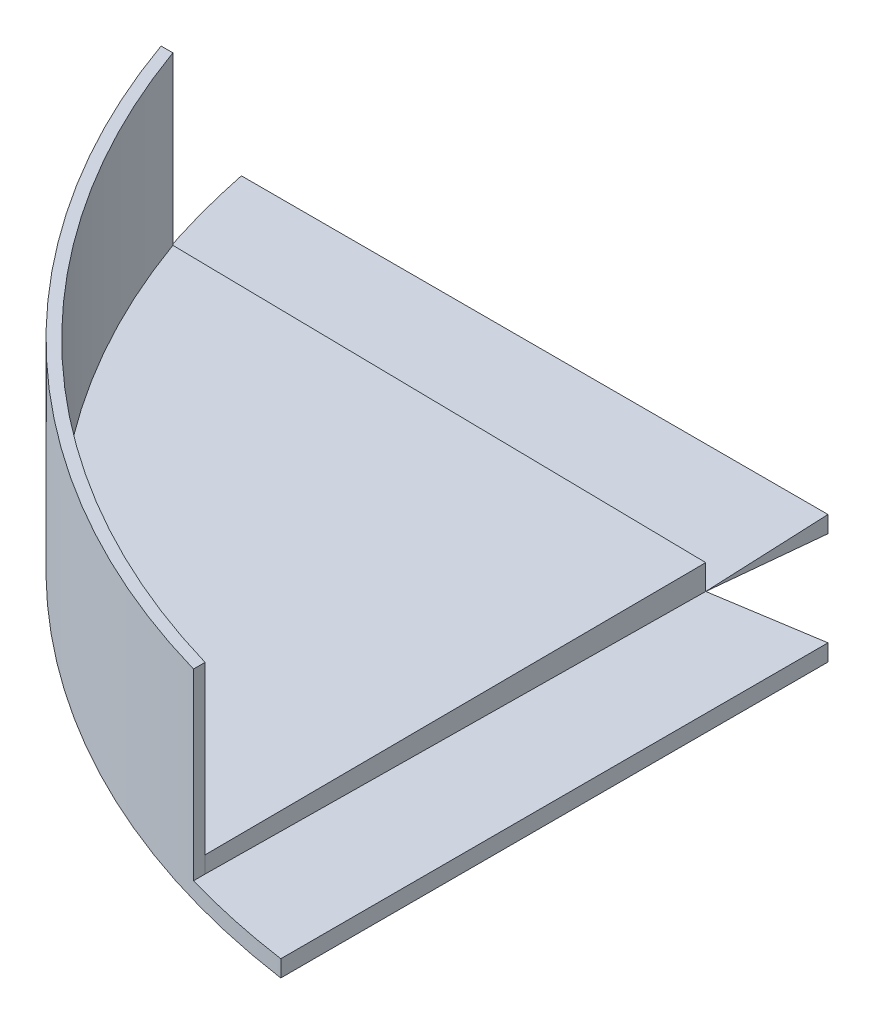
ISO-10303-21;
HEADER;
FILE_DESCRIPTION(('STEP AP214'),'2;1');
FILE_NAME('part.step','',(''),(''),'','','');
FILE_SCHEMA(('AUTOMOTIVE_DESIGN { 1 0 10303 214 1 1 1 1 }'));
ENDSEC;
DATA;
#1=APPLICATION_CONTEXT('core data for automotive mechanical design processes');
#2=APPLICATION_PROTOCOL_DEFINITION('international standard','automotive_design',2000,#1);
#3=PRODUCT_CONTEXT('',#1,'mechanical');
#4=PRODUCT('Part','Part','',(#3));
#5=PRODUCT_RELATED_PRODUCT_CATEGORY('part','',(#4));
#6=PRODUCT_DEFINITION_FORMATION('','',#4);
#7=PRODUCT_DEFINITION_CONTEXT('part definition',#1,'design');
#8=PRODUCT_DEFINITION('design','',#6,#7);
#9=PRODUCT_DEFINITION_SHAPE('','',#8);
#10=(LENGTH_UNIT() NAMED_UNIT(*) SI_UNIT(.MILLI.,.METRE.));
#11=(NAMED_UNIT(*) PLANE_ANGLE_UNIT() SI_UNIT($,.RADIAN.));
#12=(NAMED_UNIT(*) SI_UNIT($,.STERADIAN.) SOLID_ANGLE_UNIT());
#13=UNCERTAINTY_MEASURE_WITH_UNIT(LENGTH_MEASURE(1.E-05),#10,'distance_accuracy_value','');
#14=(GEOMETRIC_REPRESENTATION_CONTEXT(3) GLOBAL_UNCERTAINTY_ASSIGNED_CONTEXT((#13)) GLOBAL_UNIT_ASSIGNED_CONTEXT((#10,
#11,#12)) REPRESENTATION_CONTEXT('',''));
#15=CARTESIAN_POINT('',(0.,0.,0.));
#16=DIRECTION('',(0.,0.,1.));
#17=DIRECTION('',(1.,0.,0.));
#18=AXIS2_PLACEMENT_3D('',#15,#16,#17);
#19=CARTESIAN_POINT('',(-221.206600154719,2.,90.));
#20=DIRECTION('',(0.,1.,0.));
#21=DIRECTION('',(0.,0.,1.));
#22=AXIS2_PLACEMENT_3D('',#19,#20,#21);
#23=PLANE('',#22);
#24=DIRECTION('',(-0.0055195669768111,0.,-0.999984767074173));
#25=VECTOR('',#24,1.);
#26=CARTESIAN_POINT('',(-41.7143181817929,2.,89.0092652360406));
#27=LINE('',#26,#25);
#28=CARTESIAN_POINT('',(-41.4213562373095,2.,142.085436436891));
#29=VERTEX_POINT('',#28);
#30=CARTESIAN_POINT('',(-41.9213562373095,1.5,51.5));
#31=VERTEX_POINT('',#30);
#32=EDGE_CURVE('E151',#29,#31,#27,.T.);
#33=ORIENTED_EDGE('',*,*,#32,.F.);
#34=DIRECTION('',(0.,0.,-1.));
#35=VECTOR('',#34,1.);
#36=CARTESIAN_POINT('',(-41.4213562373095,2.,50.));
#37=LINE('',#36,#35);
#38=EDGE_CURVE('E149',#29,#31,#37,.T.);
#39=ORIENTED_EDGE('',*,*,#38,.T.);
#40=EDGE_LOOP('',(#33,#39));
#41=FACE_BOUND('',#40,.T.);
#42=ADVANCED_FACE('F34',(#41),#23,.T.);
#43=CARTESIAN_POINT('',(-221.206600154719,36.,50.));
#44=DIRECTION('',(0.,0.,1.));
#45=DIRECTION('',(1.,0.,0.));
#46=AXIS2_PLACEMENT_3D('',#43,#44,#45);
#47=PLANE('',#46);
#48=DIRECTION('',(0.,-1.,0.));
#49=VECTOR('',#48,1.);
#50=CARTESIAN_POINT('',(-139.298241194927,36.,50.));
#51=LINE('',#50,#49);
#52=CARTESIAN_POINT('',(-139.298241194927,3.,50.));
#53=VERTEX_POINT('',#52);
#54=CARTESIAN_POINT('',(-139.298241194927,6.,50.));
#55=VERTEX_POINT('',#54);
#56=EDGE_CURVE('E43',#53,#55,#51,.F.);
#57=ORIENTED_EDGE('',*,*,#56,.F.);
#58=DIRECTION('',(1.,0.,0.));
#59=VECTOR('',#58,1.);
#60=CARTESIAN_POINT('',(-41.4213562373095,3.,50.));
#61=LINE('',#60,#59);
#62=CARTESIAN_POINT('',(-141.42135623731,3.,50.0000000000001));
#63=VERTEX_POINT('',#62);
#64=EDGE_CURVE('E194',#63,#53,#61,.T.);
#65=ORIENTED_EDGE('',*,*,#64,.F.);
#66=DIRECTION('',(0.,1.,0.));
#67=VECTOR('',#66,1.);
#68=CARTESIAN_POINT('',(-141.42135623731,3.,50.0000000000001));
#69=LINE('',#68,#67);
#70=CARTESIAN_POINT('',(-141.42135623731,36.,50.0000000000001));
#71=VERTEX_POINT('',#70);
#72=EDGE_CURVE('E203',#63,#71,#69,.T.);
#73=ORIENTED_EDGE('',*,*,#72,.T.);
#74=DIRECTION('',(-1.,0.,0.));
#75=VECTOR('',#74,1.);
#76=CARTESIAN_POINT('',(-221.206600154719,36.,50.));
#77=LINE('',#76,#75);
#78=CARTESIAN_POINT('',(-139.298241194927,36.,50.));
#79=VERTEX_POINT('',#78);
#80=EDGE_CURVE('E59',#79,#71,#77,.T.);
#81=ORIENTED_EDGE('',*,*,#80,.F.);
#82=EDGE_CURVE('E132',#55,#79,#51,.F.);
#83=ORIENTED_EDGE('',*,*,#82,.F.);
#84=EDGE_LOOP('',(#57,#65,#73,#81,#83));
#85=FACE_BOUND('',#84,.T.);
#86=ADVANCED_FACE('F36',(#85),#47,.F.);
#87=DIRECTION('',(-1.,0.,0.));
#88=VECTOR('',#87,1.);
#89=CARTESIAN_POINT('',(-41.4213562373095,3.,50.));
#90=LINE('',#89,#88);
#91=CARTESIAN_POINT('',(-21.4213562373095,3.,50.));
#92=VERTEX_POINT('',#91);
#93=EDGE_CURVE('E189',#92,#31,#90,.T.);
#94=ORIENTED_EDGE('',*,*,#93,.F.);
#95=DIRECTION('',(0.,-1.,0.));
#96=VECTOR('',#95,1.);
#97=CARTESIAN_POINT('',(-21.4213562373095,36.,50.));
#98=LINE('',#97,#96);
#99=CARTESIAN_POINT('',(-21.4213562373095,0.,50.));
#100=VERTEX_POINT('',#99);
#101=EDGE_CURVE('E210',#92,#100,#98,.T.);
#102=ORIENTED_EDGE('',*,*,#101,.T.);
#103=DIRECTION('',(-1.,0.,0.));
#104=VECTOR('',#103,1.);
#105=CARTESIAN_POINT('',(-221.206600154719,0.,50.));
#106=LINE('',#105,#104);
#107=EDGE_CURVE('E205',#100,#31,#106,.T.);
#108=ORIENTED_EDGE('',*,*,#107,.T.);
#109=EDGE_LOOP('',(#94,#102,#108));
#110=FACE_BOUND('',#109,.T.);
#111=ADVANCED_FACE('F275',(#110),#47,.F.);
#112=CARTESIAN_POINT('',(-21.4213562373095,36.,90.));
#113=DIRECTION('',(1.,0.,0.));
#114=DIRECTION('',(0.,0.,-1.));
#115=AXIS2_PLACEMENT_3D('',#112,#113,#114);
#116=PLANE('',#115);
#117=ORIENTED_EDGE('',*,*,#101,.F.);
#118=DIRECTION('',(0.,0.,-1.));
#119=VECTOR('',#118,1.);
#120=CARTESIAN_POINT('',(-21.4213562373095,3.,50.));
#121=LINE('',#120,#119);
#122=CARTESIAN_POINT('',(-21.4213562373095,3.,148.462539035793));
#123=VERTEX_POINT('',#122);
#124=EDGE_CURVE('E187',#123,#92,#121,.T.);
#125=ORIENTED_EDGE('',*,*,#124,.F.);
#126=DIRECTION('',(0.,-1.,0.));
#127=VECTOR('',#126,1.);
#128=CARTESIAN_POINT('',(-21.4213562373095,36.,148.462539035793));
#129=LINE('',#128,#127);
#130=CARTESIAN_POINT('',(-21.4213562373095,0.,148.462539035793));
#131=VERTEX_POINT('',#130);
#132=EDGE_CURVE('E167',#123,#131,#129,.T.);
#133=ORIENTED_EDGE('',*,*,#132,.T.);
#134=DIRECTION('',(0.,0.,1.));
#135=VECTOR('',#134,1.);
#136=CARTESIAN_POINT('',(-21.4213562373095,0.,90.));
#137=LINE('',#136,#135);
#138=EDGE_CURVE('E208',#100,#131,#137,.T.);
#139=ORIENTED_EDGE('',*,*,#138,.F.);
#140=EDGE_LOOP('',(#117,#125,#133,#139));
#141=FACE_BOUND('',#140,.T.);
#142=ADVANCED_FACE('F224',(#141),#116,.T.);
#143=CARTESIAN_POINT('',(-41.4213562373095,36.,90.));
#144=DIRECTION('',(-1.,0.,0.));
#145=DIRECTION('',(0.,0.,1.));
#146=AXIS2_PLACEMENT_3D('',#143,#144,#145);
#147=PLANE('',#146);
#148=DIRECTION('',(0.,-1.,0.));
#149=VECTOR('',#148,1.);
#150=CARTESIAN_POINT('',(-41.4213562373095,36.,30.));
#151=LINE('',#150,#149);
#152=CARTESIAN_POINT('',(-41.4213562373095,3.,30.));
#153=VERTEX_POINT('',#152);
#154=CARTESIAN_POINT('',(-41.4213562373095,0.,30.));
#155=VERTEX_POINT('',#154);
#156=EDGE_CURVE('E159',#153,#155,#151,.T.);
#157=ORIENTED_EDGE('',*,*,#156,.F.);
#158=DIRECTION('',(0.,0.,-1.));
#159=VECTOR('',#158,1.);
#160=CARTESIAN_POINT('',(-41.4213562373095,3.,50.));
#161=LINE('',#160,#159);
#162=EDGE_CURVE('E197',#31,#153,#161,.T.);
#163=ORIENTED_EDGE('',*,*,#162,.F.);
#164=DIRECTION('',(0.,0.,-1.));
#165=VECTOR('',#164,1.);
#166=CARTESIAN_POINT('',(-41.4213562373095,0.,90.));
#167=LINE('',#166,#165);
#168=EDGE_CURVE('E214',#31,#155,#167,.T.);
#169=ORIENTED_EDGE('',*,*,#168,.T.);
#170=EDGE_LOOP('',(#157,#163,#169));
#171=FACE_BOUND('',#170,.T.);
#172=ADVANCED_FACE('F255',(#171),#147,.F.);
#173=CARTESIAN_POINT('',(-221.206600154719,36.,30.));
#174=DIRECTION('',(0.,0.,1.));
#175=DIRECTION('',(1.,0.,0.));
#176=AXIS2_PLACEMENT_3D('',#173,#174,#175);
#177=PLANE('',#176);
#178=DIRECTION('',(0.,-1.,0.));
#179=VECTOR('',#178,1.);
#180=CARTESIAN_POINT('',(-146.969384566991,36.,30.));
#181=LINE('',#180,#179);
#182=CARTESIAN_POINT('',(-146.969384566991,3.,30.));
#183=VERTEX_POINT('',#182);
#184=CARTESIAN_POINT('',(-146.969384566991,0.,30.));
#185=VERTEX_POINT('',#184);
#186=EDGE_CURVE('E160',#183,#185,#181,.T.);
#187=ORIENTED_EDGE('',*,*,#186,.F.);
#188=DIRECTION('',(-1.,0.,0.));
#189=VECTOR('',#188,1.);
#190=CARTESIAN_POINT('',(-41.4213562373095,3.,30.));
#191=LINE('',#190,#189);
#192=EDGE_CURVE('E198',#153,#183,#191,.T.);
#193=ORIENTED_EDGE('',*,*,#192,.F.);
#194=ORIENTED_EDGE('',*,*,#156,.T.);
#195=DIRECTION('',(-1.,0.,0.));
#196=VECTOR('',#195,1.);
#197=CARTESIAN_POINT('',(-221.206600154719,0.,30.));
#198=LINE('',#197,#196);
#199=EDGE_CURVE('E211',#155,#185,#198,.T.);
#200=ORIENTED_EDGE('',*,*,#199,.T.);
#201=EDGE_LOOP('',(#187,#193,#194,#200));
#202=FACE_BOUND('',#201,.T.);
#203=ADVANCED_FACE('F259',(#202),#177,.F.);
#204=CARTESIAN_POINT('',(0.,36.,0.));
#205=DIRECTION('',(0.,-1.,0.));
#206=DIRECTION('',(0.,0.,-1.));
#207=AXIS2_PLACEMENT_3D('',#204,#205,#206);
#208=CYLINDRICAL_SURFACE('',#207,150.);
#209=CARTESIAN_POINT('',(6.99440505513849E-12,3.,-3.36952687973735E-11));
#210=DIRECTION('',(0.,1.,0.));
#211=DIRECTION('',(0.,0.,1.));
#212=AXIS2_PLACEMENT_3D('',#209,#210,#211);
#213=CIRCLE('',#212,150.000000000034);
#214=CARTESIAN_POINT('',(-41.4213562373095,3.,144.167511067723));
#215=VERTEX_POINT('',#214);
#216=EDGE_CURVE('E175',#215,#123,#213,.T.);
#217=ORIENTED_EDGE('',*,*,#216,.F.);
#218=DIRECTION('',(0.,1.,0.));
#219=VECTOR('',#218,1.);
#220=CARTESIAN_POINT('',(-41.4213562373095,3.,144.167511067723));
#221=LINE('',#220,#219);
#222=CARTESIAN_POINT('',(-41.4213562373095,36.,144.167511067723));
#223=VERTEX_POINT('',#222);
#224=EDGE_CURVE('E192',#215,#223,#221,.T.);
#225=ORIENTED_EDGE('',*,*,#224,.T.);
#226=CARTESIAN_POINT('',(0.,36.,0.));
#227=DIRECTION('',(0.,1.,0.));
#228=DIRECTION('',(0.,0.,1.));
#229=AXIS2_PLACEMENT_3D('',#226,#227,#228);
#230=CIRCLE('',#229,150.);
#231=EDGE_CURVE('E207',#71,#223,#230,.T.);
#232=ORIENTED_EDGE('',*,*,#231,.F.);
#233=ORIENTED_EDGE('',*,*,#72,.F.);
#234=CARTESIAN_POINT('',(5.65381075290361E-11,3.,-1.57027169045421E-11));
#235=DIRECTION('',(0.,1.,0.));
#236=DIRECTION('',(0.,0.,-1.));
#237=AXIS2_PLACEMENT_3D('',#234,#235,#236);
#238=CIRCLE('',#237,150.000000000059);
#239=EDGE_CURVE('E200',#183,#63,#238,.T.);
#240=ORIENTED_EDGE('',*,*,#239,.F.);
#241=ORIENTED_EDGE('',*,*,#186,.T.);
#242=CARTESIAN_POINT('',(0.,0.,0.));
#243=DIRECTION('',(0.,1.,0.));
#244=DIRECTION('',(0.,0.,1.));
#245=AXIS2_PLACEMENT_3D('',#242,#243,#244);
#246=CIRCLE('',#245,150.);
#247=EDGE_CURVE('E213',#185,#131,#246,.T.);
#248=ORIENTED_EDGE('',*,*,#247,.T.);
#249=ORIENTED_EDGE('',*,*,#132,.F.);
#250=EDGE_LOOP('',(#217,#225,#232,#233,#240,#241,#248,#249));
#251=FACE_BOUND('',#250,.T.);
#252=ADVANCED_FACE('F228',(#251),#208,.T.);
#253=CARTESIAN_POINT('',(-221.206600154719,36.,90.));
#254=DIRECTION('',(0.,1.,0.));
#255=DIRECTION('',(0.,0.,1.));
#256=AXIS2_PLACEMENT_3D('',#253,#254,#255);
#257=PLANE('',#256);
#258=CARTESIAN_POINT('',(0.,36.,0.));
#259=DIRECTION('',(0.,1.,0.));
#260=DIRECTION('',(0.,0.,1.));
#261=AXIS2_PLACEMENT_3D('',#258,#259,#260);
#262=CIRCLE('',#261,148.);
#263=CARTESIAN_POINT('',(-41.4213562373095,36.,142.085436436891));
#264=VERTEX_POINT('',#263);
#265=EDGE_CURVE('E148',#79,#264,#262,.T.);
#266=ORIENTED_EDGE('',*,*,#265,.F.);
#267=ORIENTED_EDGE('',*,*,#80,.T.);
#268=ORIENTED_EDGE('',*,*,#231,.T.);
#269=DIRECTION('',(0.,0.,1.));
#270=VECTOR('',#269,1.);
#271=CARTESIAN_POINT('',(-41.4213562373095,36.,50.));
#272=LINE('',#271,#270);
#273=EDGE_CURVE('E183',#264,#223,#272,.T.);
#274=ORIENTED_EDGE('',*,*,#273,.F.);
#275=EDGE_LOOP('',(#266,#267,#268,#274));
#276=FACE_BOUND('',#275,.T.);
#277=ADVANCED_FACE('F266',(#276),#257,.T.);
#278=CARTESIAN_POINT('',(-221.206600154719,0.,90.));
#279=DIRECTION('',(0.,1.,0.));
#280=DIRECTION('',(0.,0.,1.));
#281=AXIS2_PLACEMENT_3D('',#278,#279,#280);
#282=PLANE('',#281);
#283=ORIENTED_EDGE('',*,*,#168,.F.);
#284=ORIENTED_EDGE('',*,*,#107,.F.);
#285=ORIENTED_EDGE('',*,*,#138,.T.);
#286=ORIENTED_EDGE('',*,*,#247,.F.);
#287=ORIENTED_EDGE('',*,*,#199,.F.);
#288=EDGE_LOOP('',(#283,#284,#285,#286,#287));
#289=FACE_BOUND('',#288,.T.);
#290=ADVANCED_FACE('F235',(#289),#282,.F.);
#291=CARTESIAN_POINT('',(5.65381075290361E-11,3.,-1.57027169045421E-11));
#292=DIRECTION('',(0.,-1.,0.));
#293=DIRECTION('',(0.,0.,-1.));
#294=AXIS2_PLACEMENT_3D('',#291,#292,#293);
#295=PLANE('',#294);
#296=ORIENTED_EDGE('',*,*,#64,.T.);
#297=EDGE_CURVE('E177',#53,#31,#61,.T.);
#298=ORIENTED_EDGE('',*,*,#297,.T.);
#299=ORIENTED_EDGE('',*,*,#162,.T.);
#300=ORIENTED_EDGE('',*,*,#192,.T.);
#301=ORIENTED_EDGE('',*,*,#239,.T.);
#302=EDGE_LOOP('',(#296,#298,#299,#300,#301));
#303=FACE_BOUND('',#302,.T.);
#304=ADVANCED_FACE('F258',(#303),#295,.F.);
#305=CARTESIAN_POINT('',(-41.4213562373095,3.,50.));
#306=DIRECTION('',(-1.,0.,0.));
#307=DIRECTION('',(0.,0.,1.));
#308=AXIS2_PLACEMENT_3D('',#305,#306,#307);
#309=PLANE('',#308);
#310=DIRECTION('',(0.,0.,1.));
#311=VECTOR('',#310,1.);
#312=CARTESIAN_POINT('',(-41.4213562373095,3.,50.));
#313=LINE('',#312,#311);
#314=CARTESIAN_POINT('',(-41.4213562373095,3.,142.085436436891));
#315=VERTEX_POINT('',#314);
#316=EDGE_CURVE('E176',#315,#215,#313,.T.);
#317=ORIENTED_EDGE('',*,*,#316,.F.);
#318=DIRECTION('',(0.,-1.,0.));
#319=VECTOR('',#318,1.);
#320=CARTESIAN_POINT('',(-41.4213562373095,36.,142.085436436891));
#321=LINE('',#320,#319);
#322=CARTESIAN_POINT('',(-41.4213562373095,6.,142.085436436891));
#323=VERTEX_POINT('',#322);
#324=EDGE_CURVE('E144',#315,#323,#321,.F.);
#325=ORIENTED_EDGE('',*,*,#324,.T.);
#326=EDGE_CURVE('E51',#323,#264,#321,.F.);
#327=ORIENTED_EDGE('',*,*,#326,.T.);
#328=ORIENTED_EDGE('',*,*,#273,.T.);
#329=ORIENTED_EDGE('',*,*,#224,.F.);
#330=EDGE_LOOP('',(#317,#325,#327,#328,#329));
#331=FACE_BOUND('',#330,.T.);
#332=ADVANCED_FACE('F302',(#331),#309,.F.);
#333=CARTESIAN_POINT('',(6.99440505513849E-12,3.,-3.36952687973735E-11));
#334=DIRECTION('',(0.,1.,0.));
#335=DIRECTION('',(0.,0.,1.));
#336=AXIS2_PLACEMENT_3D('',#333,#334,#335);
#337=PLANE('',#336);
#338=EDGE_CURVE('E171',#31,#315,#313,.T.);
#339=ORIENTED_EDGE('',*,*,#338,.T.);
#340=ORIENTED_EDGE('',*,*,#316,.T.);
#341=ORIENTED_EDGE('',*,*,#216,.T.);
#342=ORIENTED_EDGE('',*,*,#124,.T.);
#343=ORIENTED_EDGE('',*,*,#93,.T.);
#344=EDGE_LOOP('',(#339,#340,#341,#342,#343));
#345=FACE_BOUND('',#344,.T.);
#346=ADVANCED_FACE('F253',(#345),#337,.T.);
#347=CARTESIAN_POINT('',(-221.206600154719,36.,50.));
#348=DIRECTION('',(0.,0.,1.));
#349=DIRECTION('',(1.,0.,0.));
#350=AXIS2_PLACEMENT_3D('',#347,#348,#349);
#351=PLANE('',#350);
#352=CARTESIAN_POINT('',(-139.298241194927,2.,50.));
#353=VERTEX_POINT('',#352);
#354=EDGE_CURVE('E127',#353,#53,#51,.F.);
#355=ORIENTED_EDGE('',*,*,#354,.F.);
#356=DIRECTION('',(1.,0.,0.));
#357=VECTOR('',#356,1.);
#358=CARTESIAN_POINT('',(-221.206600154719,2.,50.));
#359=LINE('',#358,#357);
#360=EDGE_CURVE('E191',#353,#31,#359,.T.);
#361=ORIENTED_EDGE('',*,*,#360,.T.);
#362=ORIENTED_EDGE('',*,*,#297,.F.);
#363=EDGE_LOOP('',(#355,#361,#362));
#364=FACE_BOUND('',#363,.T.);
#365=ADVANCED_FACE('F288',(#364),#351,.T.);
#366=CARTESIAN_POINT('',(0.,36.,0.));
#367=DIRECTION('',(0.,-1.,0.));
#368=DIRECTION('',(0.,0.,-1.));
#369=AXIS2_PLACEMENT_3D('',#366,#367,#368);
#370=CYLINDRICAL_SURFACE('',#369,148.);
#371=CARTESIAN_POINT('',(1.13797860024079E-12,6.,-1.22124532708767E-12));
#372=DIRECTION('',(0.,-1.,0.));
#373=DIRECTION('',(0.,0.,1.));
#374=AXIS2_PLACEMENT_3D('',#371,#372,#373);
#375=CIRCLE('',#374,148.000000000001);
#376=EDGE_CURVE('E137',#323,#55,#375,.T.);
#377=ORIENTED_EDGE('',*,*,#376,.T.);
#378=ORIENTED_EDGE('',*,*,#82,.T.);
#379=ORIENTED_EDGE('',*,*,#265,.T.);
#380=ORIENTED_EDGE('',*,*,#326,.F.);
#381=EDGE_LOOP('',(#377,#378,#379,#380));
#382=FACE_BOUND('',#381,.T.);
#383=ADVANCED_FACE('F142',(#382),#370,.F.);
#384=DIRECTION('',(-0.99988137847938,0.,-0.0154022391286379));
#385=VECTOR('',#384,1.);
#386=CARTESIAN_POINT('',(-220.57115263541,2.,48.7480666770786));
#387=LINE('',#386,#385);
#388=EDGE_CURVE('E11',#31,#353,#387,.T.);
#389=ORIENTED_EDGE('',*,*,#388,.F.);
#390=ORIENTED_EDGE('',*,*,#360,.F.);
#391=EDGE_LOOP('',(#389,#390));
#392=FACE_BOUND('',#391,.T.);
#393=ADVANCED_FACE('F271',(#392),#23,.T.);
#394=CARTESIAN_POINT('',(-41.4213562373095,3.,50.));
#395=DIRECTION('',(-1.,0.,0.));
#396=DIRECTION('',(0.,0.,1.));
#397=AXIS2_PLACEMENT_3D('',#394,#395,#396);
#398=PLANE('',#397);
#399=ORIENTED_EDGE('',*,*,#38,.F.);
#400=EDGE_CURVE('E146',#29,#315,#321,.F.);
#401=ORIENTED_EDGE('',*,*,#400,.T.);
#402=ORIENTED_EDGE('',*,*,#338,.F.);
#403=EDGE_LOOP('',(#399,#401,#402));
#404=FACE_BOUND('',#403,.T.);
#405=ADVANCED_FACE('F280',(#404),#398,.T.);
#406=CARTESIAN_POINT('',(-41.4213562373095,6.,142.085436436891));
#407=DIRECTION('',(0.999984767074173,0.,-0.0055195669768111));
#408=DIRECTION('',(-0.0055195669768111,0.,-0.999984767074173));
#409=AXIS2_PLACEMENT_3D('',#406,#407,#408);
#410=PLANE('',#409);
#411=ORIENTED_EDGE('',*,*,#400,.F.);
#412=ORIENTED_EDGE('',*,*,#32,.T.);
#413=DIRECTION('',(0.,-1.,0.));
#414=VECTOR('',#413,1.);
#415=CARTESIAN_POINT('',(-41.9213562373095,6.,51.5));
#416=LINE('',#415,#414);
#417=CARTESIAN_POINT('',(-41.9213562373095,6.,51.5));
#418=VERTEX_POINT('',#417);
#419=EDGE_CURVE('E156',#418,#31,#416,.T.);
#420=ORIENTED_EDGE('',*,*,#419,.F.);
#421=DIRECTION('',(0.0055195669768111,0.,0.999984767074173));
#422=VECTOR('',#421,1.);
#423=CARTESIAN_POINT('',(-41.4213562373095,6.,142.085436436891));
#424=LINE('',#423,#422);
#425=EDGE_CURVE('E139',#418,#323,#424,.T.);
#426=ORIENTED_EDGE('',*,*,#425,.T.);
#427=ORIENTED_EDGE('',*,*,#324,.F.);
#428=EDGE_LOOP('',(#411,#412,#420,#426,#427));
#429=FACE_BOUND('',#428,.T.);
#430=ADVANCED_FACE('F286',(#429),#410,.T.);
#431=CARTESIAN_POINT('',(-41.9213562373095,6.,51.5));
#432=DIRECTION('',(0.0154022391286379,0.,-0.99988137847938));
#433=DIRECTION('',(-0.99988137847938,0.,-0.0154022391286379));
#434=AXIS2_PLACEMENT_3D('',#431,#432,#433);
#435=PLANE('',#434);
#436=ORIENTED_EDGE('',*,*,#419,.T.);
#437=ORIENTED_EDGE('',*,*,#388,.T.);
#438=ORIENTED_EDGE('',*,*,#354,.T.);
#439=ORIENTED_EDGE('',*,*,#56,.T.);
#440=DIRECTION('',(0.999881378479379,0.,0.0154022391286379));
#441=VECTOR('',#440,1.);
#442=CARTESIAN_POINT('',(-41.9213562373095,6.,51.5));
#443=LINE('',#442,#441);
#444=EDGE_CURVE('E124',#55,#418,#443,.T.);
#445=ORIENTED_EDGE('',*,*,#444,.T.);
#446=EDGE_LOOP('',(#436,#437,#438,#439,#445));
#447=FACE_BOUND('',#446,.T.);
#448=ADVANCED_FACE('F123',(#447),#435,.T.);
#449=CARTESIAN_POINT('',(1.13797860024079E-12,6.,-1.22124532708767E-12));
#450=DIRECTION('',(0.,1.,0.));
#451=DIRECTION('',(0.,0.,1.));
#452=AXIS2_PLACEMENT_3D('',#449,#450,#451);
#453=PLANE('',#452);
#454=ORIENTED_EDGE('',*,*,#376,.F.);
#455=ORIENTED_EDGE('',*,*,#425,.F.);
#456=ORIENTED_EDGE('',*,*,#444,.F.);
#457=EDGE_LOOP('',(#454,#455,#456));
#458=FACE_BOUND('',#457,.T.);
#459=ADVANCED_FACE('F136',(#458),#453,.T.);
#460=CLOSED_SHELL('',(#42,#86,#111,#142,#172,#203,#252,#277,#290,#304,#332,#346,#365,#383,#393,
#405,#430,#448,#459));
#461=MANIFOLD_SOLID_BREP('B2',#460);
#462=ADVANCED_BREP_SHAPE_REPRESENTATION('',(#18,#461),#14);
#463=SHAPE_DEFINITION_REPRESENTATION(#9,#462);
ENDSEC;
END-ISO-10303-21;
